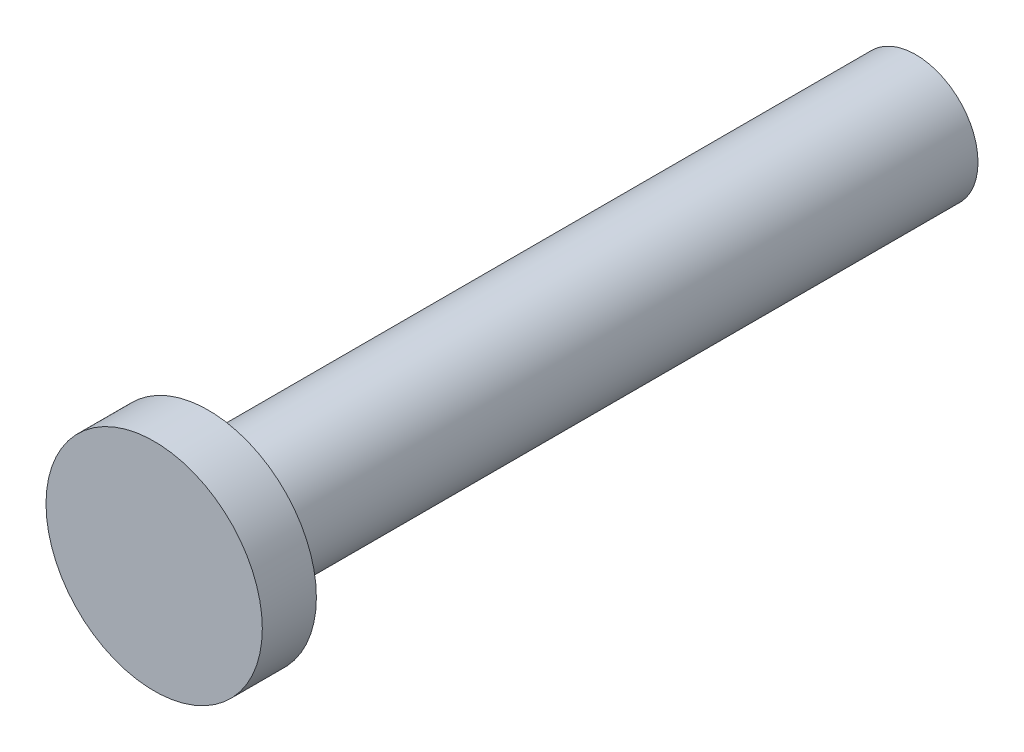
ISO-10303-21;
HEADER;
FILE_DESCRIPTION(('STEP AP214'),'2;1');
FILE_NAME('part.step','',(''),(''),'','','');
FILE_SCHEMA(('AUTOMOTIVE_DESIGN { 1 0 10303 214 1 1 1 1 }'));
ENDSEC;
DATA;
#1=APPLICATION_CONTEXT('core data for automotive mechanical design processes');
#2=APPLICATION_PROTOCOL_DEFINITION('international standard','automotive_design',2000,#1);
#3=PRODUCT_CONTEXT('',#1,'mechanical');
#4=PRODUCT('Part','Part','',(#3));
#5=PRODUCT_RELATED_PRODUCT_CATEGORY('part','',(#4));
#6=PRODUCT_DEFINITION_FORMATION('','',#4);
#7=PRODUCT_DEFINITION_CONTEXT('part definition',#1,'design');
#8=PRODUCT_DEFINITION('design','',#6,#7);
#9=PRODUCT_DEFINITION_SHAPE('','',#8);
#10=(LENGTH_UNIT() NAMED_UNIT(*) SI_UNIT(.MILLI.,.METRE.));
#11=(NAMED_UNIT(*) PLANE_ANGLE_UNIT() SI_UNIT($,.RADIAN.));
#12=(NAMED_UNIT(*) SI_UNIT($,.STERADIAN.) SOLID_ANGLE_UNIT());
#13=UNCERTAINTY_MEASURE_WITH_UNIT(LENGTH_MEASURE(1.E-05),#10,'distance_accuracy_value','');
#14=(GEOMETRIC_REPRESENTATION_CONTEXT(3) GLOBAL_UNCERTAINTY_ASSIGNED_CONTEXT((#13)) GLOBAL_UNIT_ASSIGNED_CONTEXT((#10,
#11,#12)) REPRESENTATION_CONTEXT('',''));
#15=CARTESIAN_POINT('',(0.,0.,0.));
#16=DIRECTION('',(0.,0.,1.));
#17=DIRECTION('',(1.,0.,0.));
#18=AXIS2_PLACEMENT_3D('',#15,#16,#17);
#19=CARTESIAN_POINT('',(-112.421865600067,18.5,-55.));
#20=DIRECTION('',(0.,0.,1.));
#21=DIRECTION('',(1.,0.,0.));
#22=AXIS2_PLACEMENT_3D('',#19,#20,#21);
#23=CYLINDRICAL_SURFACE('',#22,5.75);
#24=CARTESIAN_POINT('',(-112.421865600067,18.5,-55.));
#25=DIRECTION('',(0.,0.,1.));
#26=DIRECTION('',(1.,0.,0.));
#27=AXIS2_PLACEMENT_3D('',#24,#25,#26);
#28=CIRCLE('',#27,5.75);
#29=CARTESIAN_POINT('',(-106.671865600067,18.5,-55.));
#30=VERTEX_POINT('',#29);
#31=EDGE_CURVE('E10',#30,#30,#28,.T.);
#32=ORIENTED_EDGE('',*,*,#31,.T.);
#33=EDGE_LOOP('',(#32));
#34=FACE_BOUND('',#33,.T.);
#35=CARTESIAN_POINT('',(-112.421865600067,18.5,10.422066321274));
#36=DIRECTION('',(0.,0.,1.));
#37=DIRECTION('',(1.,0.,0.));
#38=AXIS2_PLACEMENT_3D('',#35,#36,#37);
#39=CIRCLE('',#38,5.75);
#40=CARTESIAN_POINT('',(-106.671865600067,18.5,10.422066321274));
#41=VERTEX_POINT('',#40);
#42=EDGE_CURVE('E43',#41,#41,#39,.T.);
#43=ORIENTED_EDGE('',*,*,#42,.F.);
#44=EDGE_LOOP('',(#43));
#45=FACE_BOUND('',#44,.T.);
#46=ADVANCED_FACE('F37',(#34,#45),#23,.T.);
#47=CARTESIAN_POINT('',(-112.421865600067,18.5,-55.));
#48=DIRECTION('',(0.,0.,1.));
#49=DIRECTION('',(1.,0.,0.));
#50=AXIS2_PLACEMENT_3D('',#47,#48,#49);
#51=PLANE('',#50);
#52=ORIENTED_EDGE('',*,*,#31,.F.);
#53=EDGE_LOOP('',(#52));
#54=FACE_BOUND('',#53,.T.);
#55=ADVANCED_FACE('F70',(#54),#51,.F.);
#56=CARTESIAN_POINT('',(-112.421865600067,18.5,15.422066321274));
#57=DIRECTION('',(0.,0.,-1.));
#58=DIRECTION('',(-1.,0.,0.));
#59=AXIS2_PLACEMENT_3D('',#56,#57,#58);
#60=CYLINDRICAL_SURFACE('',#59,9.99999999999999);
#61=CARTESIAN_POINT('',(-112.421865600067,18.5,15.422066321274));
#62=DIRECTION('',(0.,0.,1.));
#63=DIRECTION('',(1.,0.,0.));
#64=AXIS2_PLACEMENT_3D('',#61,#62,#63);
#65=CIRCLE('',#64,9.99999999999999);
#66=CARTESIAN_POINT('',(-102.421865600067,18.5,15.422066321274));
#67=VERTEX_POINT('',#66);
#68=EDGE_CURVE('E47',#67,#67,#65,.T.);
#69=ORIENTED_EDGE('',*,*,#68,.F.);
#70=EDGE_LOOP('',(#69));
#71=FACE_BOUND('',#70,.T.);
#72=CARTESIAN_POINT('',(-112.421865600067,18.5,10.422066321274));
#73=DIRECTION('',(0.,0.,1.));
#74=DIRECTION('',(1.,0.,0.));
#75=AXIS2_PLACEMENT_3D('',#72,#73,#74);
#76=CIRCLE('',#75,9.99999999999999);
#77=CARTESIAN_POINT('',(-102.421865600067,18.5,10.422066321274));
#78=VERTEX_POINT('',#77);
#79=EDGE_CURVE('E51',#78,#78,#76,.T.);
#80=ORIENTED_EDGE('',*,*,#79,.T.);
#81=EDGE_LOOP('',(#80));
#82=FACE_BOUND('',#81,.T.);
#83=ADVANCED_FACE('F57',(#71,#82),#60,.T.);
#84=CARTESIAN_POINT('',(-112.421865600067,18.5,15.422066321274));
#85=DIRECTION('',(0.,0.,1.));
#86=DIRECTION('',(1.,0.,0.));
#87=AXIS2_PLACEMENT_3D('',#84,#85,#86);
#88=PLANE('',#87);
#89=ORIENTED_EDGE('',*,*,#68,.T.);
#90=EDGE_LOOP('',(#89));
#91=FACE_BOUND('',#90,.T.);
#92=ADVANCED_FACE('F61',(#91),#88,.T.);
#93=CARTESIAN_POINT('',(-112.421865600067,18.5,10.422066321274));
#94=DIRECTION('',(0.,0.,1.));
#95=DIRECTION('',(1.,0.,0.));
#96=AXIS2_PLACEMENT_3D('',#93,#94,#95);
#97=PLANE('',#96);
#98=ORIENTED_EDGE('',*,*,#42,.T.);
#99=EDGE_LOOP('',(#98));
#100=FACE_BOUND('',#99,.T.);
#101=ORIENTED_EDGE('',*,*,#79,.F.);
#102=EDGE_LOOP('',(#101));
#103=FACE_BOUND('',#102,.T.);
#104=ADVANCED_FACE('F59',(#100,#103),#97,.F.);
#105=CLOSED_SHELL('',(#46,#55,#83,#92,#104));
#106=MANIFOLD_SOLID_BREP('B2',#105);
#107=ADVANCED_BREP_SHAPE_REPRESENTATION('',(#18,#106),#14);
#108=SHAPE_DEFINITION_REPRESENTATION(#9,#107);
ENDSEC;
END-ISO-10303-21;
